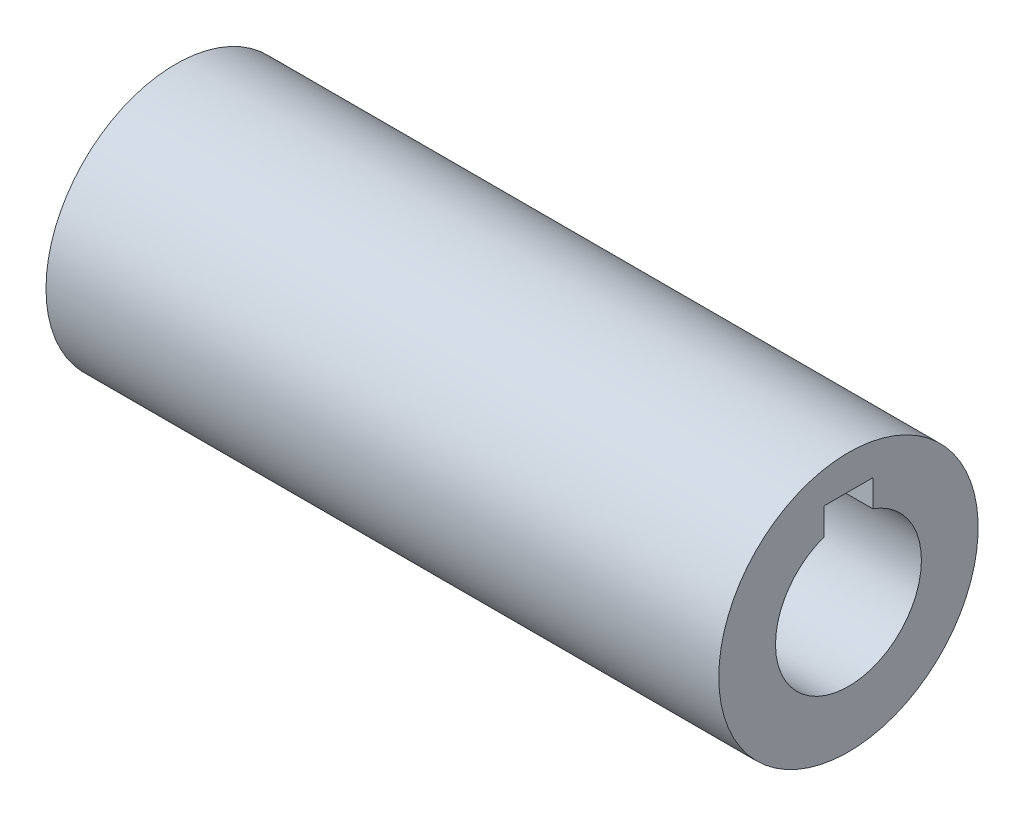
ISO-10303-21;
HEADER;
FILE_DESCRIPTION(('STEP AP214'),'2;1');
FILE_NAME('part.step','',(''),(''),'','','');
FILE_SCHEMA(('AUTOMOTIVE_DESIGN { 1 0 10303 214 1 1 1 1 }'));
ENDSEC;
DATA;
#1=APPLICATION_CONTEXT('core data for automotive mechanical design processes');
#2=APPLICATION_PROTOCOL_DEFINITION('international standard','automotive_design',2000,#1);
#3=PRODUCT_CONTEXT('',#1,'mechanical');
#4=PRODUCT('Part','Part','',(#3));
#5=PRODUCT_RELATED_PRODUCT_CATEGORY('part','',(#4));
#6=PRODUCT_DEFINITION_FORMATION('','',#4);
#7=PRODUCT_DEFINITION_CONTEXT('part definition',#1,'design');
#8=PRODUCT_DEFINITION('design','',#6,#7);
#9=PRODUCT_DEFINITION_SHAPE('','',#8);
#10=(LENGTH_UNIT() NAMED_UNIT(*) SI_UNIT(.MILLI.,.METRE.));
#11=(NAMED_UNIT(*) PLANE_ANGLE_UNIT() SI_UNIT($,.RADIAN.));
#12=(NAMED_UNIT(*) SI_UNIT($,.STERADIAN.) SOLID_ANGLE_UNIT());
#13=UNCERTAINTY_MEASURE_WITH_UNIT(LENGTH_MEASURE(1.E-05),#10,'distance_accuracy_value','');
#14=(GEOMETRIC_REPRESENTATION_CONTEXT(3) GLOBAL_UNCERTAINTY_ASSIGNED_CONTEXT((#13)) GLOBAL_UNIT_ASSIGNED_CONTEXT((#10,
#11,#12)) REPRESENTATION_CONTEXT('',''));
#15=CARTESIAN_POINT('',(0.,0.,0.));
#16=DIRECTION('',(0.,0.,1.));
#17=DIRECTION('',(1.,0.,0.));
#18=AXIS2_PLACEMENT_3D('',#15,#16,#17);
#19=CARTESIAN_POINT('',(0.,-8.21859166127046,8.));
#20=DIRECTION('',(-1.,0.,0.));
#21=DIRECTION('',(0.,1.,0.));
#22=AXIS2_PLACEMENT_3D('',#19,#20,#21);
#23=PLANE('',#22);
#24=CARTESIAN_POINT('',(0.,0.,0.));
#25=DIRECTION('',(-1.,0.,0.));
#26=DIRECTION('',(0.,0.,-1.));
#27=AXIS2_PLACEMENT_3D('',#24,#25,#26);
#28=CIRCLE('',#27,8.);
#29=CARTESIAN_POINT('',(0.,0.,-8.));
#30=VERTEX_POINT('',#29);
#31=EDGE_CURVE('E183',#30,#30,#28,.F.);
#32=ORIENTED_EDGE('',*,*,#31,.F.);
#33=EDGE_LOOP('',(#32));
#34=FACE_BOUND('',#33,.T.);
#35=ADVANCED_FACE('F16',(#34),#23,.T.);
#36=CARTESIAN_POINT('',(41.5,-8.21859166127047,-8.));
#37=DIRECTION('',(1.,0.,0.));
#38=DIRECTION('',(0.,1.,0.));
#39=AXIS2_PLACEMENT_3D('',#36,#37,#38);
#40=PLANE('',#39);
#41=CARTESIAN_POINT('',(41.5,0.,0.));
#42=DIRECTION('',(1.,0.,0.));
#43=DIRECTION('',(0.,0.,1.));
#44=AXIS2_PLACEMENT_3D('',#41,#42,#43);
#45=CIRCLE('',#44,8.);
#46=CARTESIAN_POINT('',(41.5,0.,8.));
#47=VERTEX_POINT('',#46);
#48=EDGE_CURVE('E77',#47,#47,#45,.T.);
#49=ORIENTED_EDGE('',*,*,#48,.T.);
#50=EDGE_LOOP('',(#49));
#51=FACE_BOUND('',#50,.T.);
#52=DIRECTION('',(0.,0.,-1.));
#53=VECTOR('',#52,1.);
#54=CARTESIAN_POINT('',(41.5,5.9,1.5));
#55=LINE('',#54,#53);
#56=CARTESIAN_POINT('',(41.5,5.9,-1.5));
#57=VERTEX_POINT('',#56);
#58=CARTESIAN_POINT('',(41.5,5.9,1.5));
#59=VERTEX_POINT('',#58);
#60=EDGE_CURVE('E65',#57,#59,#55,.F.);
#61=ORIENTED_EDGE('',*,*,#60,.F.);
#62=DIRECTION('',(0.,-1.,0.));
#63=VECTOR('',#62,1.);
#64=CARTESIAN_POINT('',(41.5,5.9,-1.5));
#65=LINE('',#64,#63);
#66=CARTESIAN_POINT('',(41.5,4.24264068711929,-1.5));
#67=VERTEX_POINT('',#66);
#68=EDGE_CURVE('E74',#67,#57,#65,.F.);
#69=ORIENTED_EDGE('',*,*,#68,.F.);
#70=CARTESIAN_POINT('',(41.5,0.,0.));
#71=DIRECTION('',(-1.,0.,0.));
#72=DIRECTION('',(0.,-0.999999999999997,-8.22226395753117E-08));
#73=AXIS2_PLACEMENT_3D('',#70,#71,#72);
#74=CIRCLE('',#73,4.5);
#75=CARTESIAN_POINT('',(41.5,4.24264068711928,1.5));
#76=VERTEX_POINT('',#75);
#77=EDGE_CURVE('E82',#76,#67,#74,.F.);
#78=ORIENTED_EDGE('',*,*,#77,.F.);
#79=DIRECTION('',(0.,1.,0.));
#80=VECTOR('',#79,1.);
#81=CARTESIAN_POINT('',(41.5,4.24264068711929,1.5));
#82=LINE('',#81,#80);
#83=EDGE_CURVE('E76',#59,#76,#82,.F.);
#84=ORIENTED_EDGE('',*,*,#83,.F.);
#85=EDGE_LOOP('',(#61,#69,#78,#84));
#86=FACE_BOUND('',#85,.T.);
#87=ADVANCED_FACE('F72',(#51,#86),#40,.T.);
#88=CARTESIAN_POINT('',(41.5,0.,0.));
#89=DIRECTION('',(1.,0.,0.));
#90=DIRECTION('',(0.,0.942809041582064,0.333333333333333));
#91=AXIS2_PLACEMENT_3D('',#88,#89,#90);
#92=CYLINDRICAL_SURFACE('',#91,4.5);
#93=DIRECTION('',(1.,0.,0.));
#94=VECTOR('',#93,1.);
#95=CARTESIAN_POINT('',(33.5,4.24264068711928,1.5));
#96=LINE('',#95,#94);
#97=CARTESIAN_POINT('',(33.5,4.24264068711929,1.5));
#98=VERTEX_POINT('',#97);
#99=EDGE_CURVE('E93',#98,#76,#96,.T.);
#100=ORIENTED_EDGE('',*,*,#99,.T.);
#101=ORIENTED_EDGE('',*,*,#77,.T.);
#102=DIRECTION('',(-1.,0.,0.));
#103=VECTOR('',#102,1.);
#104=CARTESIAN_POINT('',(41.5,4.24264068711928,-1.5));
#105=LINE('',#104,#103);
#106=CARTESIAN_POINT('',(33.5,4.24264068711928,-1.5));
#107=VERTEX_POINT('',#106);
#108=EDGE_CURVE('E81',#67,#107,#105,.T.);
#109=ORIENTED_EDGE('',*,*,#108,.T.);
#110=CARTESIAN_POINT('',(33.5,0.,0.));
#111=DIRECTION('',(-1.,0.,0.));
#112=DIRECTION('',(0.,0.942809041582063,-0.333333333333334));
#113=AXIS2_PLACEMENT_3D('',#110,#111,#112);
#114=CIRCLE('',#113,4.5);
#115=EDGE_CURVE('E101',#98,#107,#114,.F.);
#116=ORIENTED_EDGE('',*,*,#115,.F.);
#117=EDGE_LOOP('',(#100,#101,#109,#116));
#118=FACE_BOUND('',#117,.T.);
#119=ADVANCED_FACE('F165',(#118),#92,.F.);
#120=CARTESIAN_POINT('',(33.5,-4.75029007554003,4.79956603885631));
#121=DIRECTION('',(-1.,0.,0.));
#122=DIRECTION('',(0.,1.,0.));
#123=AXIS2_PLACEMENT_3D('',#120,#121,#122);
#124=PLANE('',#123);
#125=CARTESIAN_POINT('',(33.5,0.,0.));
#126=DIRECTION('',(-1.,0.,0.));
#127=DIRECTION('',(0.,-1.,0.));
#128=AXIS2_PLACEMENT_3D('',#125,#126,#127);
#129=CIRCLE('',#128,4.75);
#130=CARTESIAN_POINT('',(33.5,4.50693909432999,1.5));
#131=VERTEX_POINT('',#130);
#132=CARTESIAN_POINT('',(33.5,4.50693909432999,-1.5));
#133=VERTEX_POINT('',#132);
#134=EDGE_CURVE('E106',#131,#133,#129,.F.);
#135=ORIENTED_EDGE('',*,*,#134,.F.);
#136=DIRECTION('',(0.,-1.,0.));
#137=VECTOR('',#136,1.);
#138=CARTESIAN_POINT('',(33.5,4.50693909432999,1.5));
#139=LINE('',#138,#137);
#140=EDGE_CURVE('E111',#131,#98,#139,.T.);
#141=ORIENTED_EDGE('',*,*,#140,.T.);
#142=ORIENTED_EDGE('',*,*,#115,.T.);
#143=DIRECTION('',(0.,1.,0.));
#144=VECTOR('',#143,1.);
#145=CARTESIAN_POINT('',(33.5,4.24264068711929,-1.5));
#146=LINE('',#145,#144);
#147=EDGE_CURVE('E116',#107,#133,#146,.T.);
#148=ORIENTED_EDGE('',*,*,#147,.T.);
#149=EDGE_LOOP('',(#135,#141,#142,#148));
#150=FACE_BOUND('',#149,.T.);
#151=ADVANCED_FACE('F162',(#150),#124,.T.);
#152=CARTESIAN_POINT('',(41.5,0.,0.));
#153=DIRECTION('',(1.,0.,0.));
#154=DIRECTION('',(0.,0.948829283016839,0.31578947368421));
#155=AXIS2_PLACEMENT_3D('',#152,#153,#154);
#156=CYLINDRICAL_SURFACE('',#155,4.75);
#157=DIRECTION('',(1.,0.,0.));
#158=VECTOR('',#157,1.);
#159=CARTESIAN_POINT('',(21.5,4.50693909432999,1.5));
#160=LINE('',#159,#158);
#161=CARTESIAN_POINT('',(21.5,4.50693909432999,1.5));
#162=VERTEX_POINT('',#161);
#163=EDGE_CURVE('E121',#162,#131,#160,.T.);
#164=ORIENTED_EDGE('',*,*,#163,.T.);
#165=ORIENTED_EDGE('',*,*,#134,.T.);
#166=DIRECTION('',(-1.,0.,0.));
#167=VECTOR('',#166,1.);
#168=CARTESIAN_POINT('',(33.5,4.50693909432999,-1.5));
#169=LINE('',#168,#167);
#170=CARTESIAN_POINT('',(21.5,4.50693909432999,-1.5));
#171=VERTEX_POINT('',#170);
#172=EDGE_CURVE('E126',#133,#171,#169,.T.);
#173=ORIENTED_EDGE('',*,*,#172,.T.);
#174=CARTESIAN_POINT('',(21.5,0.,0.));
#175=DIRECTION('',(-1.,0.,0.));
#176=DIRECTION('',(0.,0.948829283016839,-0.315789473684211));
#177=AXIS2_PLACEMENT_3D('',#174,#175,#176);
#178=CIRCLE('',#177,4.75);
#179=EDGE_CURVE('E131',#162,#171,#178,.F.);
#180=ORIENTED_EDGE('',*,*,#179,.F.);
#181=EDGE_LOOP('',(#164,#165,#173,#180));
#182=FACE_BOUND('',#181,.T.);
#183=ADVANCED_FACE('F159',(#182),#156,.F.);
#184=CARTESIAN_POINT('',(21.5,-4.75029355597089,-4.77309376418451));
#185=DIRECTION('',(1.,0.,0.));
#186=DIRECTION('',(0.,1.,0.));
#187=AXIS2_PLACEMENT_3D('',#184,#185,#186);
#188=PLANE('',#187);
#189=DIRECTION('',(0.,-1.,0.));
#190=VECTOR('',#189,1.);
#191=CARTESIAN_POINT('',(21.5,5.9,1.5));
#192=LINE('',#191,#190);
#193=CARTESIAN_POINT('',(21.5,5.9,1.5));
#194=VERTEX_POINT('',#193);
#195=EDGE_CURVE('E136',#194,#162,#192,.T.);
#196=ORIENTED_EDGE('',*,*,#195,.T.);
#197=ORIENTED_EDGE('',*,*,#179,.T.);
#198=DIRECTION('',(0.,1.,0.));
#199=VECTOR('',#198,1.);
#200=CARTESIAN_POINT('',(21.5,4.50693909432999,-1.5));
#201=LINE('',#200,#199);
#202=CARTESIAN_POINT('',(21.5,5.9,-1.5));
#203=VERTEX_POINT('',#202);
#204=EDGE_CURVE('E141',#171,#203,#201,.T.);
#205=ORIENTED_EDGE('',*,*,#204,.T.);
#206=DIRECTION('',(0.,0.,1.));
#207=VECTOR('',#206,1.);
#208=CARTESIAN_POINT('',(21.5,5.9,-1.5));
#209=LINE('',#208,#207);
#210=EDGE_CURVE('E34',#203,#194,#209,.T.);
#211=ORIENTED_EDGE('',*,*,#210,.T.);
#212=EDGE_LOOP('',(#196,#197,#205,#211));
#213=FACE_BOUND('',#212,.T.);
#214=ADVANCED_FACE('F157',(#213),#188,.T.);
#215=CARTESIAN_POINT('',(21.5,4.24264068711928,1.5));
#216=DIRECTION('',(0.,0.,-1.));
#217=DIRECTION('',(0.,1.,0.));
#218=AXIS2_PLACEMENT_3D('',#215,#216,#217);
#219=PLANE('',#218);
#220=ORIENTED_EDGE('',*,*,#140,.F.);
#221=ORIENTED_EDGE('',*,*,#163,.F.);
#222=ORIENTED_EDGE('',*,*,#195,.F.);
#223=DIRECTION('',(1.,0.,0.));
#224=VECTOR('',#223,1.);
#225=CARTESIAN_POINT('',(21.5,5.9,1.5));
#226=LINE('',#225,#224);
#227=EDGE_CURVE('E25',#194,#59,#226,.T.);
#228=ORIENTED_EDGE('',*,*,#227,.T.);
#229=ORIENTED_EDGE('',*,*,#83,.T.);
#230=ORIENTED_EDGE('',*,*,#99,.F.);
#231=EDGE_LOOP('',(#220,#221,#222,#228,#229,#230));
#232=FACE_BOUND('',#231,.T.);
#233=ADVANCED_FACE('F154',(#232),#219,.T.);
#234=CARTESIAN_POINT('',(41.5,4.24264068711928,-1.5));
#235=DIRECTION('',(0.,0.,1.));
#236=DIRECTION('',(0.,1.,0.));
#237=AXIS2_PLACEMENT_3D('',#234,#235,#236);
#238=PLANE('',#237);
#239=ORIENTED_EDGE('',*,*,#68,.T.);
#240=DIRECTION('',(-1.,0.,0.));
#241=VECTOR('',#240,1.);
#242=CARTESIAN_POINT('',(41.5,5.9,-1.5));
#243=LINE('',#242,#241);
#244=EDGE_CURVE('E11',#203,#57,#243,.F.);
#245=ORIENTED_EDGE('',*,*,#244,.F.);
#246=ORIENTED_EDGE('',*,*,#204,.F.);
#247=ORIENTED_EDGE('',*,*,#172,.F.);
#248=ORIENTED_EDGE('',*,*,#147,.F.);
#249=ORIENTED_EDGE('',*,*,#108,.F.);
#250=EDGE_LOOP('',(#239,#245,#246,#247,#248,#249));
#251=FACE_BOUND('',#250,.T.);
#252=ADVANCED_FACE('F79',(#251),#238,.T.);
#253=CARTESIAN_POINT('',(21.5,5.9,-1.5));
#254=DIRECTION('',(0.,-1.,0.));
#255=DIRECTION('',(1.,0.,0.));
#256=AXIS2_PLACEMENT_3D('',#253,#254,#255);
#257=PLANE('',#256);
#258=ORIENTED_EDGE('',*,*,#244,.T.);
#259=ORIENTED_EDGE('',*,*,#60,.T.);
#260=ORIENTED_EDGE('',*,*,#227,.F.);
#261=ORIENTED_EDGE('',*,*,#210,.F.);
#262=EDGE_LOOP('',(#258,#259,#260,#261));
#263=FACE_BOUND('',#262,.T.);
#264=ADVANCED_FACE('F64',(#263),#257,.T.);
#265=CARTESIAN_POINT('',(41.5,0.,0.));
#266=DIRECTION('',(1.,0.,0.));
#267=DIRECTION('',(0.,0.,1.));
#268=AXIS2_PLACEMENT_3D('',#265,#266,#267);
#269=CYLINDRICAL_SURFACE('',#268,8.);
#270=ORIENTED_EDGE('',*,*,#48,.F.);
#271=EDGE_LOOP('',(#270));
#272=FACE_BOUND('',#271,.T.);
#273=ORIENTED_EDGE('',*,*,#31,.T.);
#274=EDGE_LOOP('',(#273));
#275=FACE_BOUND('',#274,.T.);
#276=ADVANCED_FACE('F18',(#272,#275),#269,.T.);
#277=CLOSED_SHELL('',(#35,#87,#119,#151,#183,#214,#233,#252,#264,#276));
#278=MANIFOLD_SOLID_BREP('B1',#277);
#279=ADVANCED_BREP_SHAPE_REPRESENTATION('',(#18,#278),#14);
#280=SHAPE_DEFINITION_REPRESENTATION(#9,#279);
ENDSEC;
END-ISO-10303-21;
